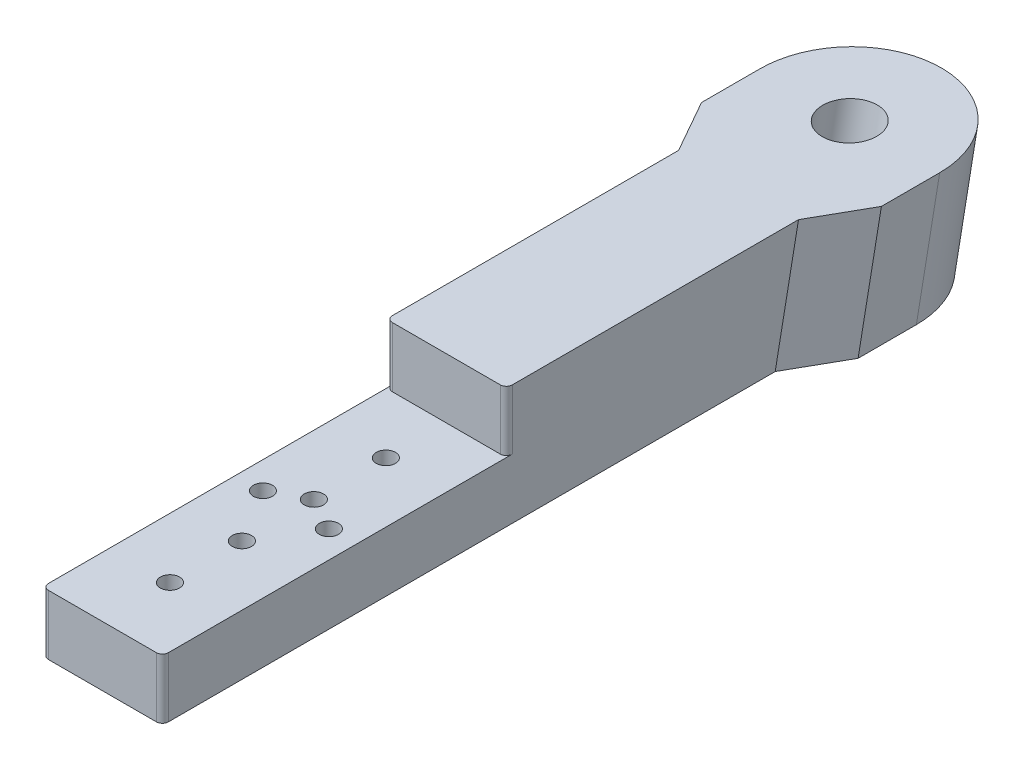
ISO-10303-21;
HEADER;
FILE_DESCRIPTION(('STEP AP214'),'2;1');
FILE_NAME('part.step','',(''),(''),'','','');
FILE_SCHEMA(('AUTOMOTIVE_DESIGN { 1 0 10303 214 1 1 1 1 }'));
ENDSEC;
DATA;
#1=APPLICATION_CONTEXT('core data for automotive mechanical design processes');
#2=APPLICATION_PROTOCOL_DEFINITION('international standard','automotive_design',2000,#1);
#3=PRODUCT_CONTEXT('',#1,'mechanical');
#4=PRODUCT('Part','Part','',(#3));
#5=PRODUCT_RELATED_PRODUCT_CATEGORY('part','',(#4));
#6=PRODUCT_DEFINITION_FORMATION('','',#4);
#7=PRODUCT_DEFINITION_CONTEXT('part definition',#1,'design');
#8=PRODUCT_DEFINITION('design','',#6,#7);
#9=PRODUCT_DEFINITION_SHAPE('','',#8);
#10=(LENGTH_UNIT() NAMED_UNIT(*) SI_UNIT(.MILLI.,.METRE.));
#11=(NAMED_UNIT(*) PLANE_ANGLE_UNIT() SI_UNIT($,.RADIAN.));
#12=(NAMED_UNIT(*) SI_UNIT($,.STERADIAN.) SOLID_ANGLE_UNIT());
#13=UNCERTAINTY_MEASURE_WITH_UNIT(LENGTH_MEASURE(1.E-05),#10,'distance_accuracy_value','');
#14=(GEOMETRIC_REPRESENTATION_CONTEXT(3) GLOBAL_UNCERTAINTY_ASSIGNED_CONTEXT((#13)) GLOBAL_UNIT_ASSIGNED_CONTEXT((#10,
#11,#12)) REPRESENTATION_CONTEXT('',''));
#15=CARTESIAN_POINT('',(0.,0.,0.));
#16=DIRECTION('',(0.,0.,1.));
#17=DIRECTION('',(1.,0.,0.));
#18=AXIS2_PLACEMENT_3D('',#15,#16,#17);
#19=CARTESIAN_POINT('',(-9.,10.,-58.35));
#20=DIRECTION('',(0.,1.,0.));
#21=DIRECTION('',(0.,0.,1.));
#22=AXIS2_PLACEMENT_3D('',#19,#20,#21);
#23=CYLINDRICAL_SURFACE('',#22,1.);
#24=CARTESIAN_POINT('',(-9.,10.,-58.35));
#25=DIRECTION('',(0.,1.,0.));
#26=DIRECTION('',(0.,0.,1.));
#27=AXIS2_PLACEMENT_3D('',#24,#25,#26);
#28=CIRCLE('',#27,1.);
#29=CARTESIAN_POINT('',(-10.,10.,-58.35));
#30=VERTEX_POINT('',#29);
#31=CARTESIAN_POINT('',(-9.,10.,-57.35));
#32=VERTEX_POINT('',#31);
#33=EDGE_CURVE('E275',#30,#32,#28,.T.);
#34=ORIENTED_EDGE('',*,*,#33,.F.);
#35=DIRECTION('',(0.,1.,0.));
#36=VECTOR('',#35,1.);
#37=CARTESIAN_POINT('',(-10.,10.,-58.35));
#38=LINE('',#37,#36);
#39=CARTESIAN_POINT('',(-10.,0.,-58.35));
#40=VERTEX_POINT('',#39);
#41=EDGE_CURVE('E218',#40,#30,#38,.T.);
#42=ORIENTED_EDGE('',*,*,#41,.F.);
#43=CARTESIAN_POINT('',(-9.,0.,-58.35));
#44=DIRECTION('',(0.,-1.,0.));
#45=DIRECTION('',(0.,0.,-1.));
#46=AXIS2_PLACEMENT_3D('',#43,#44,#45);
#47=CIRCLE('',#46,1.);
#48=CARTESIAN_POINT('',(-9.,0.,-57.35));
#49=VERTEX_POINT('',#48);
#50=EDGE_CURVE('E48',#49,#40,#47,.T.);
#51=ORIENTED_EDGE('',*,*,#50,.F.);
#52=DIRECTION('',(0.,-1.,0.));
#53=VECTOR('',#52,1.);
#54=CARTESIAN_POINT('',(-9.,0.,-57.35));
#55=LINE('',#54,#53);
#56=EDGE_CURVE('E352',#32,#49,#55,.T.);
#57=ORIENTED_EDGE('',*,*,#56,.F.);
#58=EDGE_LOOP('',(#34,#42,#51,#57));
#59=FACE_BOUND('',#58,.T.);
#60=ADVANCED_FACE('F17',(#59),#23,.T.);
#61=CARTESIAN_POINT('',(9.,-10.,-1.));
#62=DIRECTION('',(0.,1.,0.));
#63=DIRECTION('',(0.,0.,1.));
#64=AXIS2_PLACEMENT_3D('',#61,#62,#63);
#65=CYLINDRICAL_SURFACE('',#64,1.);
#66=CARTESIAN_POINT('',(9.,-10.,-1.));
#67=DIRECTION('',(0.,-1.,0.));
#68=DIRECTION('',(0.,0.,1.));
#69=AXIS2_PLACEMENT_3D('',#66,#67,#68);
#70=CIRCLE('',#69,1.);
#71=CARTESIAN_POINT('',(10.,-10.,-1.));
#72=VERTEX_POINT('',#71);
#73=CARTESIAN_POINT('',(9.,-10.,0.));
#74=VERTEX_POINT('',#73);
#75=EDGE_CURVE('E167',#72,#74,#70,.T.);
#76=ORIENTED_EDGE('',*,*,#75,.F.);
#77=DIRECTION('',(0.,-1.,0.));
#78=VECTOR('',#77,1.);
#79=CARTESIAN_POINT('',(10.,-10.,-1.));
#80=LINE('',#79,#78);
#81=CARTESIAN_POINT('',(10.,0.,-1.));
#82=VERTEX_POINT('',#81);
#83=EDGE_CURVE('E165',#82,#72,#80,.T.);
#84=ORIENTED_EDGE('',*,*,#83,.F.);
#85=CARTESIAN_POINT('',(9.,0.,-1.));
#86=DIRECTION('',(0.,1.,0.));
#87=DIRECTION('',(0.,0.,-1.));
#88=AXIS2_PLACEMENT_3D('',#85,#86,#87);
#89=CIRCLE('',#88,1.);
#90=CARTESIAN_POINT('',(9.,0.,0.));
#91=VERTEX_POINT('',#90);
#92=EDGE_CURVE('E150',#91,#82,#89,.T.);
#93=ORIENTED_EDGE('',*,*,#92,.F.);
#94=DIRECTION('',(0.,1.,0.));
#95=VECTOR('',#94,1.);
#96=CARTESIAN_POINT('',(9.,-10.,0.));
#97=LINE('',#96,#95);
#98=EDGE_CURVE('E205',#74,#91,#97,.T.);
#99=ORIENTED_EDGE('',*,*,#98,.F.);
#100=EDGE_LOOP('',(#76,#84,#93,#99));
#101=FACE_BOUND('',#100,.T.);
#102=ADVANCED_FACE('F166',(#101),#65,.T.);
#103=CARTESIAN_POINT('',(-9.,-10.,-1.));
#104=DIRECTION('',(0.,1.,0.));
#105=DIRECTION('',(0.,0.,1.));
#106=AXIS2_PLACEMENT_3D('',#103,#104,#105);
#107=CYLINDRICAL_SURFACE('',#106,1.);
#108=CARTESIAN_POINT('',(-9.,-10.,-1.));
#109=DIRECTION('',(0.,-1.,0.));
#110=DIRECTION('',(0.,0.,1.));
#111=AXIS2_PLACEMENT_3D('',#108,#109,#110);
#112=CIRCLE('',#111,1.);
#113=CARTESIAN_POINT('',(-9.,-10.,0.));
#114=VERTEX_POINT('',#113);
#115=CARTESIAN_POINT('',(-10.,-10.,-1.));
#116=VERTEX_POINT('',#115);
#117=EDGE_CURVE('E290',#114,#116,#112,.T.);
#118=ORIENTED_EDGE('',*,*,#117,.F.);
#119=DIRECTION('',(0.,-1.,0.));
#120=VECTOR('',#119,1.);
#121=CARTESIAN_POINT('',(-9.,-10.,0.));
#122=LINE('',#121,#120);
#123=CARTESIAN_POINT('',(-9.,0.,0.));
#124=VERTEX_POINT('',#123);
#125=EDGE_CURVE('E278',#124,#114,#122,.T.);
#126=ORIENTED_EDGE('',*,*,#125,.F.);
#127=CARTESIAN_POINT('',(-9.,0.,-1.));
#128=DIRECTION('',(0.,1.,0.));
#129=DIRECTION('',(0.,0.,-1.));
#130=AXIS2_PLACEMENT_3D('',#127,#128,#129);
#131=CIRCLE('',#130,1.);
#132=CARTESIAN_POINT('',(-10.,0.,-1.));
#133=VERTEX_POINT('',#132);
#134=EDGE_CURVE('E260',#133,#124,#131,.T.);
#135=ORIENTED_EDGE('',*,*,#134,.F.);
#136=DIRECTION('',(0.,1.,0.));
#137=VECTOR('',#136,1.);
#138=CARTESIAN_POINT('',(-10.,-10.,-1.));
#139=LINE('',#138,#137);
#140=EDGE_CURVE('E254',#116,#133,#139,.T.);
#141=ORIENTED_EDGE('',*,*,#140,.F.);
#142=EDGE_LOOP('',(#118,#126,#135,#141));
#143=FACE_BOUND('',#142,.T.);
#144=ADVANCED_FACE('F19',(#143),#107,.T.);
#145=CARTESIAN_POINT('',(9.,10.,-58.35));
#146=DIRECTION('',(0.,-1.,0.));
#147=DIRECTION('',(0.,0.,-1.));
#148=AXIS2_PLACEMENT_3D('',#145,#146,#147);
#149=CYLINDRICAL_SURFACE('',#148,1.);
#150=CARTESIAN_POINT('',(9.,0.,-58.35));
#151=DIRECTION('',(0.,-1.,0.));
#152=DIRECTION('',(0.,0.,-1.));
#153=AXIS2_PLACEMENT_3D('',#150,#151,#152);
#154=CIRCLE('',#153,1.);
#155=CARTESIAN_POINT('',(10.,0.,-58.35));
#156=VERTEX_POINT('',#155);
#157=CARTESIAN_POINT('',(9.,0.,-57.35));
#158=VERTEX_POINT('',#157);
#159=EDGE_CURVE('E38',#156,#158,#154,.T.);
#160=ORIENTED_EDGE('',*,*,#159,.F.);
#161=DIRECTION('',(0.,-1.,0.));
#162=VECTOR('',#161,1.);
#163=CARTESIAN_POINT('',(10.,0.,-58.35));
#164=LINE('',#163,#162);
#165=CARTESIAN_POINT('',(10.,10.,-58.35));
#166=VERTEX_POINT('',#165);
#167=EDGE_CURVE('E178',#166,#156,#164,.T.);
#168=ORIENTED_EDGE('',*,*,#167,.F.);
#169=CARTESIAN_POINT('',(9.,10.,-58.35));
#170=DIRECTION('',(0.,1.,0.));
#171=DIRECTION('',(0.,0.,1.));
#172=AXIS2_PLACEMENT_3D('',#169,#170,#171);
#173=CIRCLE('',#172,1.);
#174=CARTESIAN_POINT('',(9.,10.,-57.35));
#175=VERTEX_POINT('',#174);
#176=EDGE_CURVE('E274',#175,#166,#173,.T.);
#177=ORIENTED_EDGE('',*,*,#176,.F.);
#178=DIRECTION('',(0.,1.,0.));
#179=VECTOR('',#178,1.);
#180=CARTESIAN_POINT('',(9.,10.,-57.35));
#181=LINE('',#180,#179);
#182=EDGE_CURVE('E359',#158,#175,#181,.T.);
#183=ORIENTED_EDGE('',*,*,#182,.F.);
#184=EDGE_LOOP('',(#160,#168,#177,#183));
#185=FACE_BOUND('',#184,.T.);
#186=ADVANCED_FACE('F914',(#185),#149,.T.);
#187=CARTESIAN_POINT('',(0.,-81.8751465584887,-106.76053018556));
#188=DIRECTION('',(0.,0.981627183447664,-0.190808995376545));
#189=DIRECTION('',(0.,0.190808995376545,0.981627183447664));
#190=AXIS2_PLACEMENT_3D('',#187,#188,#189);
#191=CYLINDRICAL_SURFACE('',#190,4.5);
#192=CARTESIAN_POINT('',(0.,-10.,-120.731643392917));
#193=DIRECTION('',(0.,1.,0.));
#194=DIRECTION('',(0.,0.,-1.));
#195=AXIS2_PLACEMENT_3D('',#192,#193,#194);
#196=ELLIPSE('',#195,4.58422512729847,4.5);
#197=CARTESIAN_POINT('',(0.,-10.,-125.315868520215));
#198=VERTEX_POINT('',#197);
#199=EDGE_CURVE('E282',#198,#198,#196,.T.);
#200=ORIENTED_EDGE('',*,*,#199,.F.);
#201=EDGE_LOOP('',(#200));
#202=FACE_BOUND('',#201,.T.);
#203=CARTESIAN_POINT('',(0.,10.,-124.619249575672));
#204=DIRECTION('',(0.,1.,0.));
#205=DIRECTION('',(0.,0.,-1.));
#206=AXIS2_PLACEMENT_3D('',#203,#204,#205);
#207=ELLIPSE('',#206,4.58422512729847,4.5);
#208=CARTESIAN_POINT('',(0.,10.,-129.20347470297));
#209=VERTEX_POINT('',#208);
#210=EDGE_CURVE('E330',#209,#209,#207,.T.);
#211=ORIENTED_EDGE('',*,*,#210,.T.);
#212=EDGE_LOOP('',(#211));
#213=FACE_BOUND('',#212,.T.);
#214=ADVANCED_FACE('F879',(#202,#213),#191,.F.);
#215=CARTESIAN_POINT('',(10.,-29.1405329647453,-98.4695057315924));
#216=DIRECTION('',(-0.866025403784438,-0.0954044976882726,-0.490813591723833));
#217=DIRECTION('',(-0.493062653792701,0.,0.869993804250869));
#218=AXIS2_PLACEMENT_3D('',#215,#216,#217);
#219=PLANE('',#218);
#220=DIRECTION('',(-0.493062653792701,0.,0.869993804250869));
#221=VECTOR('',#220,1.);
#222=CARTESIAN_POINT('',(-36.2666995620343,-10.,-20.5538879047038));
#223=LINE('',#222,#221);
#224=CARTESIAN_POINT('',(15.,-10.,-111.012393817246));
#225=VERTEX_POINT('',#224);
#226=CARTESIAN_POINT('',(10.,-10.,-102.19004844634));
#227=VERTEX_POINT('',#226);
#228=EDGE_CURVE('E266',#225,#227,#223,.T.);
#229=ORIENTED_EDGE('',*,*,#228,.F.);
#230=DIRECTION('',(0.,-0.981627183447664,0.190808995376545));
#231=VECTOR('',#230,1.);
#232=CARTESIAN_POINT('',(15.,10.,-114.9));
#233=LINE('',#232,#231);
#234=CARTESIAN_POINT('',(15.,10.,-114.9));
#235=VERTEX_POINT('',#234);
#236=EDGE_CURVE('E225',#235,#225,#233,.T.);
#237=ORIENTED_EDGE('',*,*,#236,.F.);
#238=DIRECTION('',(0.493062653792701,0.,-0.869993804250869));
#239=VECTOR('',#238,1.);
#240=CARTESIAN_POINT('',(6.73639738738543,10.,-100.31912874872));
#241=LINE('',#240,#239);
#242=CARTESIAN_POINT('',(10.,10.,-106.077654629095));
#243=VERTEX_POINT('',#242);
#244=EDGE_CURVE('E296',#243,#235,#241,.T.);
#245=ORIENTED_EDGE('',*,*,#244,.F.);
#246=DIRECTION('',(0.,0.981627183447664,-0.190808995376545));
#247=VECTOR('',#246,1.);
#248=CARTESIAN_POINT('',(10.,-29.1405329647453,-98.4695057315924));
#249=LINE('',#248,#247);
#250=EDGE_CURVE('E209',#227,#243,#249,.T.);
#251=ORIENTED_EDGE('',*,*,#250,.F.);
#252=EDGE_LOOP('',(#229,#237,#245,#251));
#253=FACE_BOUND('',#252,.T.);
#254=ADVANCED_FACE('F440',(#253),#219,.F.);
#255=CARTESIAN_POINT('',(-10.,-7.61938417300112,-102.65279328673));
#256=DIRECTION('',(0.866025403784438,-0.0954044976882725,-0.490813591723833));
#257=DIRECTION('',(0.,-0.981627183447664,0.190808995376544));
#258=AXIS2_PLACEMENT_3D('',#255,#256,#257);
#259=PLANE('',#258);
#260=DIRECTION('',(0.4930626537927,0.,0.869993804250869));
#261=VECTOR('',#260,1.);
#262=CARTESIAN_POINT('',(-8.53086649914911,10.,-103.485414001));
#263=LINE('',#262,#261);
#264=CARTESIAN_POINT('',(-15.,10.,-114.9));
#265=VERTEX_POINT('',#264);
#266=CARTESIAN_POINT('',(-10.,10.,-106.077654629095));
#267=VERTEX_POINT('',#266);
#268=EDGE_CURVE('E346',#265,#267,#263,.T.);
#269=ORIENTED_EDGE('',*,*,#268,.F.);
#270=DIRECTION('',(0.,-0.981627183447664,0.190808995376545));
#271=VECTOR('',#270,1.);
#272=CARTESIAN_POINT('',(-15.,10.,-114.9));
#273=LINE('',#272,#271);
#274=CARTESIAN_POINT('',(-15.,-10.,-111.012393817246));
#275=VERTEX_POINT('',#274);
#276=EDGE_CURVE('E11',#265,#275,#273,.T.);
#277=ORIENTED_EDGE('',*,*,#276,.T.);
#278=DIRECTION('',(-0.4930626537927,0.,-0.869993804250869));
#279=VECTOR('',#278,1.);
#280=CARTESIAN_POINT('',(36.2666995620342,-10.,-20.5538879047038));
#281=LINE('',#280,#279);
#282=CARTESIAN_POINT('',(-10.,-10.,-102.19004844634));
#283=VERTEX_POINT('',#282);
#284=EDGE_CURVE('E238',#283,#275,#281,.T.);
#285=ORIENTED_EDGE('',*,*,#284,.F.);
#286=DIRECTION('',(0.,-0.981627183447664,0.190808995376545));
#287=VECTOR('',#286,1.);
#288=CARTESIAN_POINT('',(-10.,-7.61938417300112,-102.65279328673));
#289=LINE('',#288,#287);
#290=EDGE_CURVE('E242',#267,#283,#289,.T.);
#291=ORIENTED_EDGE('',*,*,#290,.F.);
#292=EDGE_LOOP('',(#269,#277,#285,#291));
#293=FACE_BOUND('',#292,.T.);
#294=ADVANCED_FACE('F429',(#293),#259,.F.);
#295=CARTESIAN_POINT('',(0.,-22.9775155516287,-118.209069908152));
#296=DIRECTION('',(0.,-0.981627183447664,0.190808995376544));
#297=DIRECTION('',(0.,-0.190808995376544,-0.981627183447664));
#298=AXIS2_PLACEMENT_3D('',#295,#296,#297);
#299=CYLINDRICAL_SURFACE('',#298,15.);
#300=CARTESIAN_POINT('',(0.,-10.,-120.731643392917));
#301=DIRECTION('',(0.,-1.,0.));
#302=DIRECTION('',(0.,0.,1.));
#303=AXIS2_PLACEMENT_3D('',#300,#301,#302);
#304=ELLIPSE('',#303,15.2807504243282,15.);
#305=CARTESIAN_POINT('',(-15.,-10.,-120.731643392917));
#306=VERTEX_POINT('',#305);
#307=CARTESIAN_POINT('',(15.,-10.,-120.731643392917));
#308=VERTEX_POINT('',#307);
#309=EDGE_CURVE('E237',#306,#308,#304,.T.);
#310=ORIENTED_EDGE('',*,*,#309,.F.);
#311=DIRECTION('',(0.,-0.981627183447664,0.190808995376544));
#312=VECTOR('',#311,1.);
#313=CARTESIAN_POINT('',(-15.,-22.9775155516287,-118.209069908152));
#314=LINE('',#313,#312);
#315=CARTESIAN_POINT('',(-15.,10.,-124.619249575672));
#316=VERTEX_POINT('',#315);
#317=EDGE_CURVE('E26',#316,#306,#314,.T.);
#318=ORIENTED_EDGE('',*,*,#317,.F.);
#319=CARTESIAN_POINT('',(0.,10.,-124.619249575672));
#320=DIRECTION('',(0.,1.,0.));
#321=DIRECTION('',(0.,0.,1.));
#322=AXIS2_PLACEMENT_3D('',#319,#320,#321);
#323=ELLIPSE('',#322,15.2807504243282,15.);
#324=CARTESIAN_POINT('',(15.,10.,-124.619249575672));
#325=VERTEX_POINT('',#324);
#326=EDGE_CURVE('E295',#325,#316,#323,.T.);
#327=ORIENTED_EDGE('',*,*,#326,.F.);
#328=DIRECTION('',(0.,0.981627183447664,-0.190808995376544));
#329=VECTOR('',#328,1.);
#330=CARTESIAN_POINT('',(15.,12.8621349306482,-125.175592248285));
#331=LINE('',#330,#329);
#332=EDGE_CURVE('E222',#308,#325,#331,.T.);
#333=ORIENTED_EDGE('',*,*,#332,.F.);
#334=EDGE_LOOP('',(#310,#318,#327,#333));
#335=FACE_BOUND('',#334,.T.);
#336=ADVANCED_FACE('F420',(#335),#299,.T.);
#337=CARTESIAN_POINT('',(-15.,0.,0.));
#338=DIRECTION('',(1.,0.,0.));
#339=DIRECTION('',(0.,-1.,0.));
#340=AXIS2_PLACEMENT_3D('',#337,#338,#339);
#341=PLANE('',#340);
#342=DIRECTION('',(0.,0.,1.));
#343=VECTOR('',#342,1.);
#344=CARTESIAN_POINT('',(-15.,10.,-139.9));
#345=LINE('',#344,#343);
#346=EDGE_CURVE('E342',#316,#265,#345,.T.);
#347=ORIENTED_EDGE('',*,*,#346,.F.);
#348=ORIENTED_EDGE('',*,*,#317,.T.);
#349=DIRECTION('',(0.,0.,-1.));
#350=VECTOR('',#349,1.);
#351=CARTESIAN_POINT('',(-15.,-10.,-111.012393817246));
#352=LINE('',#351,#350);
#353=EDGE_CURVE('E233',#275,#306,#352,.T.);
#354=ORIENTED_EDGE('',*,*,#353,.F.);
#355=ORIENTED_EDGE('',*,*,#276,.F.);
#356=EDGE_LOOP('',(#347,#348,#354,#355));
#357=FACE_BOUND('',#356,.T.);
#358=ADVANCED_FACE('F417',(#357),#341,.F.);
#359=CARTESIAN_POINT('',(15.,0.,0.));
#360=DIRECTION('',(1.,0.,0.));
#361=DIRECTION('',(0.,-1.,0.));
#362=AXIS2_PLACEMENT_3D('',#359,#360,#361);
#363=PLANE('',#362);
#364=DIRECTION('',(0.,0.,-1.));
#365=VECTOR('',#364,1.);
#366=CARTESIAN_POINT('',(15.,-10.,-111.012393817246));
#367=LINE('',#366,#365);
#368=EDGE_CURVE('E250',#225,#308,#367,.T.);
#369=ORIENTED_EDGE('',*,*,#368,.T.);
#370=ORIENTED_EDGE('',*,*,#332,.T.);
#371=DIRECTION('',(0.,0.,1.));
#372=VECTOR('',#371,1.);
#373=CARTESIAN_POINT('',(15.,10.,-139.9));
#374=LINE('',#373,#372);
#375=EDGE_CURVE('E291',#325,#235,#374,.T.);
#376=ORIENTED_EDGE('',*,*,#375,.T.);
#377=ORIENTED_EDGE('',*,*,#236,.T.);
#378=EDGE_LOOP('',(#369,#370,#376,#377));
#379=FACE_BOUND('',#378,.T.);
#380=ADVANCED_FACE('F436',(#379),#363,.T.);
#381=CARTESIAN_POINT('',(5.5,110.,-32.26));
#382=DIRECTION('',(0.,-1.,0.));
#383=DIRECTION('',(0.,0.,-1.));
#384=AXIS2_PLACEMENT_3D('',#381,#382,#383);
#385=CYLINDRICAL_SURFACE('',#384,1.6);
#386=CARTESIAN_POINT('',(5.5,0.,-32.26));
#387=DIRECTION('',(0.,1.,0.));
#388=DIRECTION('',(0.,0.,-1.));
#389=AXIS2_PLACEMENT_3D('',#386,#387,#388);
#390=CIRCLE('',#389,1.6);
#391=CARTESIAN_POINT('',(5.5,0.,-33.86));
#392=VERTEX_POINT('',#391);
#393=EDGE_CURVE('E197',#392,#392,#390,.T.);
#394=ORIENTED_EDGE('',*,*,#393,.T.);
#395=EDGE_LOOP('',(#394));
#396=FACE_BOUND('',#395,.T.);
#397=CARTESIAN_POINT('',(5.5,-4.3,-32.26));
#398=DIRECTION('',(0.,-1.,0.));
#399=DIRECTION('',(0.,0.,1.));
#400=AXIS2_PLACEMENT_3D('',#397,#398,#399);
#401=CIRCLE('',#400,1.6);
#402=CARTESIAN_POINT('',(5.5,-4.3,-30.66));
#403=VERTEX_POINT('',#402);
#404=EDGE_CURVE('E204',#403,#403,#401,.T.);
#405=ORIENTED_EDGE('',*,*,#404,.T.);
#406=EDGE_LOOP('',(#405));
#407=FACE_BOUND('',#406,.T.);
#408=ADVANCED_FACE('F861',(#396,#407),#385,.F.);
#409=CARTESIAN_POINT('',(-5.5,110.,-32.26));
#410=DIRECTION('',(0.,-1.,0.));
#411=DIRECTION('',(0.,0.,-1.));
#412=AXIS2_PLACEMENT_3D('',#409,#410,#411);
#413=CYLINDRICAL_SURFACE('',#412,1.6);
#414=CARTESIAN_POINT('',(-5.5,0.,-32.26));
#415=DIRECTION('',(0.,1.,0.));
#416=DIRECTION('',(0.,0.,-1.));
#417=AXIS2_PLACEMENT_3D('',#414,#415,#416);
#418=CIRCLE('',#417,1.6);
#419=CARTESIAN_POINT('',(-5.5,0.,-33.86));
#420=VERTEX_POINT('',#419);
#421=EDGE_CURVE('E305',#420,#420,#418,.T.);
#422=ORIENTED_EDGE('',*,*,#421,.T.);
#423=EDGE_LOOP('',(#422));
#424=FACE_BOUND('',#423,.T.);
#425=CARTESIAN_POINT('',(-5.5,-4.3,-32.26));
#426=DIRECTION('',(0.,-1.,0.));
#427=DIRECTION('',(0.,0.,1.));
#428=AXIS2_PLACEMENT_3D('',#425,#426,#427);
#429=CIRCLE('',#428,1.6);
#430=CARTESIAN_POINT('',(-5.5,-4.3,-30.66));
#431=VERTEX_POINT('',#430);
#432=EDGE_CURVE('E203',#431,#431,#429,.T.);
#433=ORIENTED_EDGE('',*,*,#432,.T.);
#434=EDGE_LOOP('',(#433));
#435=FACE_BOUND('',#434,.T.);
#436=ADVANCED_FACE('F852',(#424,#435),#413,.F.);
#437=CARTESIAN_POINT('',(-5.5,-4.3,-32.26));
#438=DIRECTION('',(0.,-1.,0.));
#439=DIRECTION('',(0.,0.,-1.));
#440=AXIS2_PLACEMENT_3D('',#437,#438,#439);
#441=CYLINDRICAL_SURFACE('',#440,2.3);
#442=CARTESIAN_POINT('',(-5.5,-10.,-32.26));
#443=DIRECTION('',(0.,1.,0.));
#444=DIRECTION('',(0.,0.,1.));
#445=AXIS2_PLACEMENT_3D('',#442,#443,#444);
#446=CIRCLE('',#445,2.3);
#447=CARTESIAN_POINT('',(-5.5,-10.,-29.96));
#448=VERTEX_POINT('',#447);
#449=EDGE_CURVE('E326',#448,#448,#446,.T.);
#450=ORIENTED_EDGE('',*,*,#449,.F.);
#451=EDGE_LOOP('',(#450));
#452=FACE_BOUND('',#451,.T.);
#453=CARTESIAN_POINT('',(-5.5,-4.3,-32.26));
#454=DIRECTION('',(0.,1.,0.));
#455=DIRECTION('',(0.,0.,1.));
#456=AXIS2_PLACEMENT_3D('',#453,#454,#455);
#457=CIRCLE('',#456,2.3);
#458=CARTESIAN_POINT('',(-5.5,-4.3,-29.96));
#459=VERTEX_POINT('',#458);
#460=EDGE_CURVE('E226',#459,#459,#457,.T.);
#461=ORIENTED_EDGE('',*,*,#460,.T.);
#462=EDGE_LOOP('',(#461));
#463=FACE_BOUND('',#462,.T.);
#464=ADVANCED_FACE('F843',(#452,#463),#441,.F.);
#465=CARTESIAN_POINT('',(-5.5,-4.3,-32.26));
#466=DIRECTION('',(0.,1.,0.));
#467=DIRECTION('',(1.,0.,0.));
#468=AXIS2_PLACEMENT_3D('',#465,#466,#467);
#469=PLANE('',#468);
#470=ORIENTED_EDGE('',*,*,#460,.F.);
#471=EDGE_LOOP('',(#470));
#472=FACE_BOUND('',#471,.T.);
#473=ORIENTED_EDGE('',*,*,#432,.F.);
#474=EDGE_LOOP('',(#473));
#475=FACE_BOUND('',#474,.T.);
#476=ADVANCED_FACE('F834',(#472,#475),#469,.F.);
#477=CARTESIAN_POINT('',(5.5,-4.3,-32.26));
#478=DIRECTION('',(0.,-1.,0.));
#479=DIRECTION('',(0.,0.,-1.));
#480=AXIS2_PLACEMENT_3D('',#477,#478,#479);
#481=CYLINDRICAL_SURFACE('',#480,2.3);
#482=CARTESIAN_POINT('',(5.5,-10.,-32.26));
#483=DIRECTION('',(0.,1.,0.));
#484=DIRECTION('',(0.,0.,1.));
#485=AXIS2_PLACEMENT_3D('',#482,#483,#484);
#486=CIRCLE('',#485,2.3);
#487=CARTESIAN_POINT('',(5.5,-10.,-29.96));
#488=VERTEX_POINT('',#487);
#489=EDGE_CURVE('E322',#488,#488,#486,.T.);
#490=ORIENTED_EDGE('',*,*,#489,.F.);
#491=EDGE_LOOP('',(#490));
#492=FACE_BOUND('',#491,.T.);
#493=CARTESIAN_POINT('',(5.5,-4.3,-32.26));
#494=DIRECTION('',(0.,1.,0.));
#495=DIRECTION('',(0.,0.,1.));
#496=AXIS2_PLACEMENT_3D('',#493,#494,#495);
#497=CIRCLE('',#496,2.3);
#498=CARTESIAN_POINT('',(5.5,-4.3,-29.96));
#499=VERTEX_POINT('',#498);
#500=EDGE_CURVE('E199',#499,#499,#497,.T.);
#501=ORIENTED_EDGE('',*,*,#500,.T.);
#502=EDGE_LOOP('',(#501));
#503=FACE_BOUND('',#502,.T.);
#504=ADVANCED_FACE('F825',(#492,#503),#481,.F.);
#505=CARTESIAN_POINT('',(5.5,-4.3,-32.26));
#506=DIRECTION('',(0.,1.,0.));
#507=DIRECTION('',(1.,0.,0.));
#508=AXIS2_PLACEMENT_3D('',#505,#506,#507);
#509=PLANE('',#508);
#510=ORIENTED_EDGE('',*,*,#500,.F.);
#511=EDGE_LOOP('',(#510));
#512=FACE_BOUND('',#511,.T.);
#513=ORIENTED_EDGE('',*,*,#404,.F.);
#514=EDGE_LOOP('',(#513));
#515=FACE_BOUND('',#514,.T.);
#516=ADVANCED_FACE('F717',(#512,#515),#509,.F.);
#517=CARTESIAN_POINT('',(0.,-6.,-35.26));
#518=DIRECTION('',(0.,-1.,0.));
#519=DIRECTION('',(0.,0.,-1.));
#520=AXIS2_PLACEMENT_3D('',#517,#518,#519);
#521=CYLINDRICAL_SURFACE('',#520,3.);
#522=CARTESIAN_POINT('',(0.,-10.,-35.26));
#523=DIRECTION('',(0.,1.,0.));
#524=DIRECTION('',(0.,0.,1.));
#525=AXIS2_PLACEMENT_3D('',#522,#523,#524);
#526=CIRCLE('',#525,3.);
#527=CARTESIAN_POINT('',(0.,-10.,-32.26));
#528=VERTEX_POINT('',#527);
#529=EDGE_CURVE('E314',#528,#528,#526,.T.);
#530=ORIENTED_EDGE('',*,*,#529,.F.);
#531=EDGE_LOOP('',(#530));
#532=FACE_BOUND('',#531,.T.);
#533=CARTESIAN_POINT('',(0.,-6.,-35.26));
#534=DIRECTION('',(0.,1.,0.));
#535=DIRECTION('',(0.,0.,1.));
#536=AXIS2_PLACEMENT_3D('',#533,#534,#535);
#537=CIRCLE('',#536,3.);
#538=CARTESIAN_POINT('',(0.,-6.,-32.26));
#539=VERTEX_POINT('',#538);
#540=EDGE_CURVE('E396',#539,#539,#537,.T.);
#541=ORIENTED_EDGE('',*,*,#540,.T.);
#542=EDGE_LOOP('',(#541));
#543=FACE_BOUND('',#542,.T.);
#544=ADVANCED_FACE('F711',(#532,#543),#521,.F.);
#545=CARTESIAN_POINT('',(0.,-6.,-35.26));
#546=DIRECTION('',(0.,1.,0.));
#547=DIRECTION('',(1.,0.,0.));
#548=AXIS2_PLACEMENT_3D('',#545,#546,#547);
#549=PLANE('',#548);
#550=CARTESIAN_POINT('',(0.,-6.,-35.26));
#551=DIRECTION('',(0.,-1.,0.));
#552=DIRECTION('',(0.,0.,1.));
#553=AXIS2_PLACEMENT_3D('',#550,#551,#552);
#554=CIRCLE('',#553,1.6);
#555=CARTESIAN_POINT('',(0.,-6.,-33.66));
#556=VERTEX_POINT('',#555);
#557=EDGE_CURVE('E192',#556,#556,#554,.T.);
#558=ORIENTED_EDGE('',*,*,#557,.F.);
#559=EDGE_LOOP('',(#558));
#560=FACE_BOUND('',#559,.T.);
#561=ORIENTED_EDGE('',*,*,#540,.F.);
#562=EDGE_LOOP('',(#561));
#563=FACE_BOUND('',#562,.T.);
#564=ADVANCED_FACE('F716',(#560,#563),#549,.F.);
#565=CARTESIAN_POINT('',(0.,-6.,-47.26));
#566=DIRECTION('',(0.,-1.,0.));
#567=DIRECTION('',(0.,0.,-1.));
#568=AXIS2_PLACEMENT_3D('',#565,#566,#567);
#569=CYLINDRICAL_SURFACE('',#568,3.);
#570=CARTESIAN_POINT('',(0.,-10.,-47.26));
#571=DIRECTION('',(0.,1.,0.));
#572=DIRECTION('',(0.,0.,1.));
#573=AXIS2_PLACEMENT_3D('',#570,#571,#572);
#574=CIRCLE('',#573,3.);
#575=CARTESIAN_POINT('',(0.,-10.,-44.26));
#576=VERTEX_POINT('',#575);
#577=EDGE_CURVE('E318',#576,#576,#574,.T.);
#578=ORIENTED_EDGE('',*,*,#577,.F.);
#579=EDGE_LOOP('',(#578));
#580=FACE_BOUND('',#579,.T.);
#581=CARTESIAN_POINT('',(0.,-6.,-47.26));
#582=DIRECTION('',(0.,1.,0.));
#583=DIRECTION('',(0.,0.,1.));
#584=AXIS2_PLACEMENT_3D('',#581,#582,#583);
#585=CIRCLE('',#584,3.);
#586=CARTESIAN_POINT('',(0.,-6.,-44.26));
#587=VERTEX_POINT('',#586);
#588=EDGE_CURVE('E392',#587,#587,#585,.T.);
#589=ORIENTED_EDGE('',*,*,#588,.T.);
#590=EDGE_LOOP('',(#589));
#591=FACE_BOUND('',#590,.T.);
#592=ADVANCED_FACE('F648',(#580,#591),#569,.F.);
#593=CARTESIAN_POINT('',(0.,-6.,-47.26));
#594=DIRECTION('',(0.,1.,0.));
#595=DIRECTION('',(1.,0.,0.));
#596=AXIS2_PLACEMENT_3D('',#593,#594,#595);
#597=PLANE('',#596);
#598=CARTESIAN_POINT('',(0.,-6.,-47.26));
#599=DIRECTION('',(0.,-1.,0.));
#600=DIRECTION('',(0.,0.,1.));
#601=AXIS2_PLACEMENT_3D('',#598,#599,#600);
#602=CIRCLE('',#601,1.6);
#603=CARTESIAN_POINT('',(0.,-6.,-45.66));
#604=VERTEX_POINT('',#603);
#605=EDGE_CURVE('E188',#604,#604,#602,.T.);
#606=ORIENTED_EDGE('',*,*,#605,.F.);
#607=EDGE_LOOP('',(#606));
#608=FACE_BOUND('',#607,.T.);
#609=ORIENTED_EDGE('',*,*,#588,.F.);
#610=EDGE_LOOP('',(#609));
#611=FACE_BOUND('',#610,.T.);
#612=ADVANCED_FACE('F642',(#608,#611),#597,.F.);
#613=CARTESIAN_POINT('',(0.,-6.,-11.26));
#614=DIRECTION('',(0.,-1.,0.));
#615=DIRECTION('',(0.,0.,-1.));
#616=AXIS2_PLACEMENT_3D('',#613,#614,#615);
#617=CYLINDRICAL_SURFACE('',#616,3.);
#618=CARTESIAN_POINT('',(0.,-10.,-11.26));
#619=DIRECTION('',(0.,1.,0.));
#620=DIRECTION('',(0.,0.,1.));
#621=AXIS2_PLACEMENT_3D('',#618,#619,#620);
#622=CIRCLE('',#621,3.);
#623=CARTESIAN_POINT('',(0.,-10.,-8.26));
#624=VERTEX_POINT('',#623);
#625=EDGE_CURVE('E261',#624,#624,#622,.T.);
#626=ORIENTED_EDGE('',*,*,#625,.F.);
#627=EDGE_LOOP('',(#626));
#628=FACE_BOUND('',#627,.T.);
#629=CARTESIAN_POINT('',(0.,-6.,-11.26));
#630=DIRECTION('',(0.,1.,0.));
#631=DIRECTION('',(0.,0.,1.));
#632=AXIS2_PLACEMENT_3D('',#629,#630,#631);
#633=CIRCLE('',#632,3.);
#634=CARTESIAN_POINT('',(0.,-6.,-8.26));
#635=VERTEX_POINT('',#634);
#636=EDGE_CURVE('E388',#635,#635,#633,.T.);
#637=ORIENTED_EDGE('',*,*,#636,.T.);
#638=EDGE_LOOP('',(#637));
#639=FACE_BOUND('',#638,.T.);
#640=ADVANCED_FACE('F647',(#628,#639),#617,.F.);
#641=CARTESIAN_POINT('',(0.,-6.,-11.26));
#642=DIRECTION('',(0.,1.,0.));
#643=DIRECTION('',(1.,0.,0.));
#644=AXIS2_PLACEMENT_3D('',#641,#642,#643);
#645=PLANE('',#644);
#646=CARTESIAN_POINT('',(0.,-6.,-11.26));
#647=DIRECTION('',(0.,-1.,0.));
#648=DIRECTION('',(0.,0.,1.));
#649=AXIS2_PLACEMENT_3D('',#646,#647,#648);
#650=CIRCLE('',#649,1.6);
#651=CARTESIAN_POINT('',(0.,-6.,-9.66));
#652=VERTEX_POINT('',#651);
#653=EDGE_CURVE('E186',#652,#652,#650,.T.);
#654=ORIENTED_EDGE('',*,*,#653,.F.);
#655=EDGE_LOOP('',(#654));
#656=FACE_BOUND('',#655,.T.);
#657=ORIENTED_EDGE('',*,*,#636,.F.);
#658=EDGE_LOOP('',(#657));
#659=FACE_BOUND('',#658,.T.);
#660=ADVANCED_FACE('F757',(#656,#659),#645,.F.);
#661=CARTESIAN_POINT('',(0.,-6.,-23.26));
#662=DIRECTION('',(0.,-1.,0.));
#663=DIRECTION('',(0.,0.,-1.));
#664=AXIS2_PLACEMENT_3D('',#661,#662,#663);
#665=CYLINDRICAL_SURFACE('',#664,3.);
#666=CARTESIAN_POINT('',(0.,-10.,-23.26));
#667=DIRECTION('',(0.,1.,0.));
#668=DIRECTION('',(0.,0.,1.));
#669=AXIS2_PLACEMENT_3D('',#666,#667,#668);
#670=CIRCLE('',#669,3.);
#671=CARTESIAN_POINT('',(0.,-10.,-20.26));
#672=VERTEX_POINT('',#671);
#673=EDGE_CURVE('E265',#672,#672,#670,.T.);
#674=ORIENTED_EDGE('',*,*,#673,.F.);
#675=EDGE_LOOP('',(#674));
#676=FACE_BOUND('',#675,.T.);
#677=CARTESIAN_POINT('',(0.,-6.,-23.26));
#678=DIRECTION('',(0.,1.,0.));
#679=DIRECTION('',(0.,0.,1.));
#680=AXIS2_PLACEMENT_3D('',#677,#678,#679);
#681=CIRCLE('',#680,3.);
#682=CARTESIAN_POINT('',(0.,-6.,-20.26));
#683=VERTEX_POINT('',#682);
#684=EDGE_CURVE('E384',#683,#683,#681,.T.);
#685=ORIENTED_EDGE('',*,*,#684,.T.);
#686=EDGE_LOOP('',(#685));
#687=FACE_BOUND('',#686,.T.);
#688=ADVANCED_FACE('F788',(#676,#687),#665,.F.);
#689=CARTESIAN_POINT('',(0.,-6.,-23.26));
#690=DIRECTION('',(0.,1.,0.));
#691=DIRECTION('',(1.,0.,0.));
#692=AXIS2_PLACEMENT_3D('',#689,#690,#691);
#693=PLANE('',#692);
#694=CARTESIAN_POINT('',(0.,-6.,-23.26));
#695=DIRECTION('',(0.,-1.,0.));
#696=DIRECTION('',(0.,0.,1.));
#697=AXIS2_PLACEMENT_3D('',#694,#695,#696);
#698=CIRCLE('',#697,1.6);
#699=CARTESIAN_POINT('',(0.,-6.,-21.66));
#700=VERTEX_POINT('',#699);
#701=EDGE_CURVE('E380',#700,#700,#698,.T.);
#702=ORIENTED_EDGE('',*,*,#701,.F.);
#703=EDGE_LOOP('',(#702));
#704=FACE_BOUND('',#703,.T.);
#705=ORIENTED_EDGE('',*,*,#684,.F.);
#706=EDGE_LOOP('',(#705));
#707=FACE_BOUND('',#706,.T.);
#708=ADVANCED_FACE('F678',(#704,#707),#693,.F.);
#709=CARTESIAN_POINT('',(0.,165.,-23.26));
#710=DIRECTION('',(0.,-1.,0.));
#711=DIRECTION('',(0.,0.,-1.));
#712=AXIS2_PLACEMENT_3D('',#709,#710,#711);
#713=CYLINDRICAL_SURFACE('',#712,1.6);
#714=CARTESIAN_POINT('',(0.,0.,-23.26));
#715=DIRECTION('',(0.,-1.,0.));
#716=DIRECTION('',(0.,0.,-1.));
#717=AXIS2_PLACEMENT_3D('',#714,#715,#716);
#718=CIRCLE('',#717,1.6);
#719=CARTESIAN_POINT('',(0.,0.,-24.86));
#720=VERTEX_POINT('',#719);
#721=EDGE_CURVE('E193',#720,#720,#718,.T.);
#722=ORIENTED_EDGE('',*,*,#721,.F.);
#723=EDGE_LOOP('',(#722));
#724=FACE_BOUND('',#723,.T.);
#725=ORIENTED_EDGE('',*,*,#701,.T.);
#726=EDGE_LOOP('',(#725));
#727=FACE_BOUND('',#726,.T.);
#728=ADVANCED_FACE('F672',(#724,#727),#713,.F.);
#729=CARTESIAN_POINT('',(0.,165.,-11.26));
#730=DIRECTION('',(0.,-1.,0.));
#731=DIRECTION('',(0.,0.,-1.));
#732=AXIS2_PLACEMENT_3D('',#729,#730,#731);
#733=CYLINDRICAL_SURFACE('',#732,1.6);
#734=CARTESIAN_POINT('',(0.,0.,-11.26));
#735=DIRECTION('',(0.,-1.,0.));
#736=DIRECTION('',(0.,0.,-1.));
#737=AXIS2_PLACEMENT_3D('',#734,#735,#736);
#738=CIRCLE('',#737,1.6);
#739=CARTESIAN_POINT('',(0.,0.,-12.86));
#740=VERTEX_POINT('',#739);
#741=EDGE_CURVE('E196',#740,#740,#738,.T.);
#742=ORIENTED_EDGE('',*,*,#741,.F.);
#743=EDGE_LOOP('',(#742));
#744=FACE_BOUND('',#743,.T.);
#745=ORIENTED_EDGE('',*,*,#653,.T.);
#746=EDGE_LOOP('',(#745));
#747=FACE_BOUND('',#746,.T.);
#748=ADVANCED_FACE('F677',(#744,#747),#733,.F.);
#749=CARTESIAN_POINT('',(0.,165.,-47.26));
#750=DIRECTION('',(0.,-1.,0.));
#751=DIRECTION('',(0.,0.,-1.));
#752=AXIS2_PLACEMENT_3D('',#749,#750,#751);
#753=CYLINDRICAL_SURFACE('',#752,1.6);
#754=CARTESIAN_POINT('',(0.,0.,-47.26));
#755=DIRECTION('',(0.,-1.,0.));
#756=DIRECTION('',(0.,0.,-1.));
#757=AXIS2_PLACEMENT_3D('',#754,#755,#756);
#758=CIRCLE('',#757,1.6);
#759=CARTESIAN_POINT('',(0.,0.,-48.86));
#760=VERTEX_POINT('',#759);
#761=EDGE_CURVE('E368',#760,#760,#758,.T.);
#762=ORIENTED_EDGE('',*,*,#761,.F.);
#763=EDGE_LOOP('',(#762));
#764=FACE_BOUND('',#763,.T.);
#765=ORIENTED_EDGE('',*,*,#605,.T.);
#766=EDGE_LOOP('',(#765));
#767=FACE_BOUND('',#766,.T.);
#768=ADVANCED_FACE('F733',(#764,#767),#753,.F.);
#769=CARTESIAN_POINT('',(0.,165.,-35.26));
#770=DIRECTION('',(0.,-1.,0.));
#771=DIRECTION('',(0.,0.,-1.));
#772=AXIS2_PLACEMENT_3D('',#769,#770,#771);
#773=CYLINDRICAL_SURFACE('',#772,1.6);
#774=CARTESIAN_POINT('',(0.,0.,-35.26));
#775=DIRECTION('',(0.,-1.,0.));
#776=DIRECTION('',(0.,0.,-1.));
#777=AXIS2_PLACEMENT_3D('',#774,#775,#776);
#778=CIRCLE('',#777,1.6);
#779=CARTESIAN_POINT('',(0.,0.,-36.86));
#780=VERTEX_POINT('',#779);
#781=EDGE_CURVE('E162',#780,#780,#778,.T.);
#782=ORIENTED_EDGE('',*,*,#781,.F.);
#783=EDGE_LOOP('',(#782));
#784=FACE_BOUND('',#783,.T.);
#785=ORIENTED_EDGE('',*,*,#557,.T.);
#786=EDGE_LOOP('',(#785));
#787=FACE_BOUND('',#786,.T.);
#788=ADVANCED_FACE('F742',(#784,#787),#773,.F.);
#789=CARTESIAN_POINT('',(305.,0.,-57.35));
#790=DIRECTION('',(0.,-1.,0.));
#791=DIRECTION('',(0.,0.,-1.));
#792=AXIS2_PLACEMENT_3D('',#789,#790,#791);
#793=PLANE('',#792);
#794=DIRECTION('',(-1.,0.,0.));
#795=VECTOR('',#794,1.);
#796=CARTESIAN_POINT('',(305.,0.,0.));
#797=LINE('',#796,#795);
#798=EDGE_CURVE('E157',#91,#124,#797,.T.);
#799=ORIENTED_EDGE('',*,*,#798,.F.);
#800=ORIENTED_EDGE('',*,*,#92,.T.);
#801=DIRECTION('',(0.,0.,-1.));
#802=VECTOR('',#801,1.);
#803=CARTESIAN_POINT('',(10.,0.,0.));
#804=LINE('',#803,#802);
#805=EDGE_CURVE('E155',#82,#156,#804,.T.);
#806=ORIENTED_EDGE('',*,*,#805,.T.);
#807=ORIENTED_EDGE('',*,*,#159,.T.);
#808=DIRECTION('',(-1.,0.,0.));
#809=VECTOR('',#808,1.);
#810=CARTESIAN_POINT('',(305.,0.,-57.35));
#811=LINE('',#810,#809);
#812=EDGE_CURVE('E356',#158,#49,#811,.T.);
#813=ORIENTED_EDGE('',*,*,#812,.T.);
#814=ORIENTED_EDGE('',*,*,#50,.T.);
#815=DIRECTION('',(0.,0.,1.));
#816=VECTOR('',#815,1.);
#817=CARTESIAN_POINT('',(-10.,0.,-114.9));
#818=LINE('',#817,#816);
#819=EDGE_CURVE('E214',#40,#133,#818,.T.);
#820=ORIENTED_EDGE('',*,*,#819,.T.);
#821=ORIENTED_EDGE('',*,*,#134,.T.);
#822=EDGE_LOOP('',(#799,#800,#806,#807,#813,#814,#820,#821));
#823=FACE_BOUND('',#822,.T.);
#824=ORIENTED_EDGE('',*,*,#781,.T.);
#825=EDGE_LOOP('',(#824));
#826=FACE_BOUND('',#825,.T.);
#827=ORIENTED_EDGE('',*,*,#761,.T.);
#828=EDGE_LOOP('',(#827));
#829=FACE_BOUND('',#828,.T.);
#830=ORIENTED_EDGE('',*,*,#741,.T.);
#831=EDGE_LOOP('',(#830));
#832=FACE_BOUND('',#831,.T.);
#833=ORIENTED_EDGE('',*,*,#721,.T.);
#834=EDGE_LOOP('',(#833));
#835=FACE_BOUND('',#834,.T.);
#836=ORIENTED_EDGE('',*,*,#393,.F.);
#837=EDGE_LOOP('',(#836));
#838=FACE_BOUND('',#837,.T.);
#839=ORIENTED_EDGE('',*,*,#421,.F.);
#840=EDGE_LOOP('',(#839));
#841=FACE_BOUND('',#840,.T.);
#842=ADVANCED_FACE('F152',(#823,#826,#829,#832,#835,#838,#841),#793,.F.);
#843=CARTESIAN_POINT('',(305.,10.,-57.35));
#844=DIRECTION('',(0.,0.,-1.));
#845=DIRECTION('',(0.,-1.,0.));
#846=AXIS2_PLACEMENT_3D('',#843,#844,#845);
#847=PLANE('',#846);
#848=DIRECTION('',(-1.,0.,0.));
#849=VECTOR('',#848,1.);
#850=CARTESIAN_POINT('',(305.,10.,-57.35));
#851=LINE('',#850,#849);
#852=EDGE_CURVE('E270',#175,#32,#851,.T.);
#853=ORIENTED_EDGE('',*,*,#852,.T.);
#854=ORIENTED_EDGE('',*,*,#56,.T.);
#855=ORIENTED_EDGE('',*,*,#812,.F.);
#856=ORIENTED_EDGE('',*,*,#182,.T.);
#857=EDGE_LOOP('',(#853,#854,#855,#856));
#858=FACE_BOUND('',#857,.T.);
#859=ADVANCED_FACE('F693',(#858),#847,.F.);
#860=CARTESIAN_POINT('',(0.,10.,0.));
#861=DIRECTION('',(0.,1.,0.));
#862=DIRECTION('',(1.,0.,0.));
#863=AXIS2_PLACEMENT_3D('',#860,#861,#862);
#864=PLANE('',#863);
#865=DIRECTION('',(0.,0.,1.));
#866=VECTOR('',#865,1.);
#867=CARTESIAN_POINT('',(-10.,10.,-114.9));
#868=LINE('',#867,#866);
#869=EDGE_CURVE('E232',#267,#30,#868,.T.);
#870=ORIENTED_EDGE('',*,*,#869,.T.);
#871=ORIENTED_EDGE('',*,*,#33,.T.);
#872=ORIENTED_EDGE('',*,*,#852,.F.);
#873=ORIENTED_EDGE('',*,*,#176,.T.);
#874=DIRECTION('',(0.,0.,-1.));
#875=VECTOR('',#874,1.);
#876=CARTESIAN_POINT('',(10.,10.,0.));
#877=LINE('',#876,#875);
#878=EDGE_CURVE('E213',#166,#243,#877,.T.);
#879=ORIENTED_EDGE('',*,*,#878,.T.);
#880=ORIENTED_EDGE('',*,*,#244,.T.);
#881=ORIENTED_EDGE('',*,*,#375,.F.);
#882=ORIENTED_EDGE('',*,*,#326,.T.);
#883=ORIENTED_EDGE('',*,*,#346,.T.);
#884=ORIENTED_EDGE('',*,*,#268,.T.);
#885=EDGE_LOOP('',(#870,#871,#872,#873,#879,#880,#881,#882,#883,#884));
#886=FACE_BOUND('',#885,.T.);
#887=ORIENTED_EDGE('',*,*,#210,.F.);
#888=EDGE_LOOP('',(#887));
#889=FACE_BOUND('',#888,.T.);
#890=ADVANCED_FACE('F432',(#886,#889),#864,.T.);
#891=CARTESIAN_POINT('',(0.,-10.,0.));
#892=DIRECTION('',(0.,1.,0.));
#893=DIRECTION('',(1.,0.,0.));
#894=AXIS2_PLACEMENT_3D('',#891,#892,#893);
#895=PLANE('',#894);
#896=ORIENTED_EDGE('',*,*,#449,.T.);
#897=EDGE_LOOP('',(#896));
#898=FACE_BOUND('',#897,.T.);
#899=ORIENTED_EDGE('',*,*,#489,.T.);
#900=EDGE_LOOP('',(#899));
#901=FACE_BOUND('',#900,.T.);
#902=ORIENTED_EDGE('',*,*,#577,.T.);
#903=EDGE_LOOP('',(#902));
#904=FACE_BOUND('',#903,.T.);
#905=ORIENTED_EDGE('',*,*,#529,.T.);
#906=EDGE_LOOP('',(#905));
#907=FACE_BOUND('',#906,.T.);
#908=ORIENTED_EDGE('',*,*,#673,.T.);
#909=EDGE_LOOP('',(#908));
#910=FACE_BOUND('',#909,.T.);
#911=ORIENTED_EDGE('',*,*,#625,.T.);
#912=EDGE_LOOP('',(#911));
#913=FACE_BOUND('',#912,.T.);
#914=DIRECTION('',(0.,0.,-1.));
#915=VECTOR('',#914,1.);
#916=CARTESIAN_POINT('',(10.,-10.,0.));
#917=LINE('',#916,#915);
#918=EDGE_CURVE('E172',#72,#227,#917,.T.);
#919=ORIENTED_EDGE('',*,*,#918,.F.);
#920=ORIENTED_EDGE('',*,*,#75,.T.);
#921=DIRECTION('',(1.,0.,0.));
#922=VECTOR('',#921,1.);
#923=CARTESIAN_POINT('',(-10.,-10.,0.));
#924=LINE('',#923,#922);
#925=EDGE_CURVE('E208',#114,#74,#924,.T.);
#926=ORIENTED_EDGE('',*,*,#925,.F.);
#927=ORIENTED_EDGE('',*,*,#117,.T.);
#928=DIRECTION('',(0.,0.,1.));
#929=VECTOR('',#928,1.);
#930=CARTESIAN_POINT('',(-10.,-10.,-114.9));
#931=LINE('',#930,#929);
#932=EDGE_CURVE('E246',#283,#116,#931,.T.);
#933=ORIENTED_EDGE('',*,*,#932,.F.);
#934=ORIENTED_EDGE('',*,*,#284,.T.);
#935=ORIENTED_EDGE('',*,*,#353,.T.);
#936=ORIENTED_EDGE('',*,*,#309,.T.);
#937=ORIENTED_EDGE('',*,*,#368,.F.);
#938=ORIENTED_EDGE('',*,*,#228,.T.);
#939=EDGE_LOOP('',(#919,#920,#926,#927,#933,#934,#935,#936,#937,#938));
#940=FACE_BOUND('',#939,.T.);
#941=ORIENTED_EDGE('',*,*,#199,.T.);
#942=EDGE_LOOP('',(#941));
#943=FACE_BOUND('',#942,.T.);
#944=ADVANCED_FACE('F423',(#898,#901,#904,#907,#910,#913,#940,#943),#895,.F.);
#945=CARTESIAN_POINT('',(-10.,-10.,0.));
#946=DIRECTION('',(0.,0.,1.));
#947=DIRECTION('',(1.,0.,0.));
#948=AXIS2_PLACEMENT_3D('',#945,#946,#947);
#949=PLANE('',#948);
#950=ORIENTED_EDGE('',*,*,#925,.T.);
#951=ORIENTED_EDGE('',*,*,#98,.T.);
#952=ORIENTED_EDGE('',*,*,#798,.T.);
#953=ORIENTED_EDGE('',*,*,#125,.T.);
#954=EDGE_LOOP('',(#950,#951,#952,#953));
#955=FACE_BOUND('',#954,.T.);
#956=ADVANCED_FACE('F666',(#955),#949,.T.);
#957=CARTESIAN_POINT('',(-10.,-10.,-114.9));
#958=DIRECTION('',(-1.,0.,0.));
#959=DIRECTION('',(0.,1.,0.));
#960=AXIS2_PLACEMENT_3D('',#957,#958,#959);
#961=PLANE('',#960);
#962=ORIENTED_EDGE('',*,*,#819,.F.);
#963=ORIENTED_EDGE('',*,*,#41,.T.);
#964=ORIENTED_EDGE('',*,*,#869,.F.);
#965=ORIENTED_EDGE('',*,*,#290,.T.);
#966=ORIENTED_EDGE('',*,*,#932,.T.);
#967=ORIENTED_EDGE('',*,*,#140,.T.);
#968=EDGE_LOOP('',(#962,#963,#964,#965,#966,#967));
#969=FACE_BOUND('',#968,.T.);
#970=ADVANCED_FACE('F658',(#969),#961,.T.);
#971=CARTESIAN_POINT('',(10.,-10.,0.));
#972=DIRECTION('',(1.,0.,0.));
#973=DIRECTION('',(0.,0.,1.));
#974=AXIS2_PLACEMENT_3D('',#971,#972,#973);
#975=PLANE('',#974);
#976=ORIENTED_EDGE('',*,*,#805,.F.);
#977=ORIENTED_EDGE('',*,*,#83,.T.);
#978=ORIENTED_EDGE('',*,*,#918,.T.);
#979=ORIENTED_EDGE('',*,*,#250,.T.);
#980=ORIENTED_EDGE('',*,*,#878,.F.);
#981=ORIENTED_EDGE('',*,*,#167,.T.);
#982=EDGE_LOOP('',(#976,#977,#978,#979,#980,#981));
#983=FACE_BOUND('',#982,.T.);
#984=ADVANCED_FACE('F175',(#983),#975,.T.);
#985=CLOSED_SHELL('',(#60,#102,#144,#186,#214,#254,#294,#336,#358,#380,#408,#436,#464,#476,#504,
#516,#544,#564,#592,#612,#640,#660,#688,#708,#728,#748,#768,#788,#842,#859,#890,#944,#956,#970,#984));
#986=MANIFOLD_SOLID_BREP('B1',#985);
#987=ADVANCED_BREP_SHAPE_REPRESENTATION('',(#18,#986),#14);
#988=SHAPE_DEFINITION_REPRESENTATION(#9,#987);
ENDSEC;
END-ISO-10303-21;
